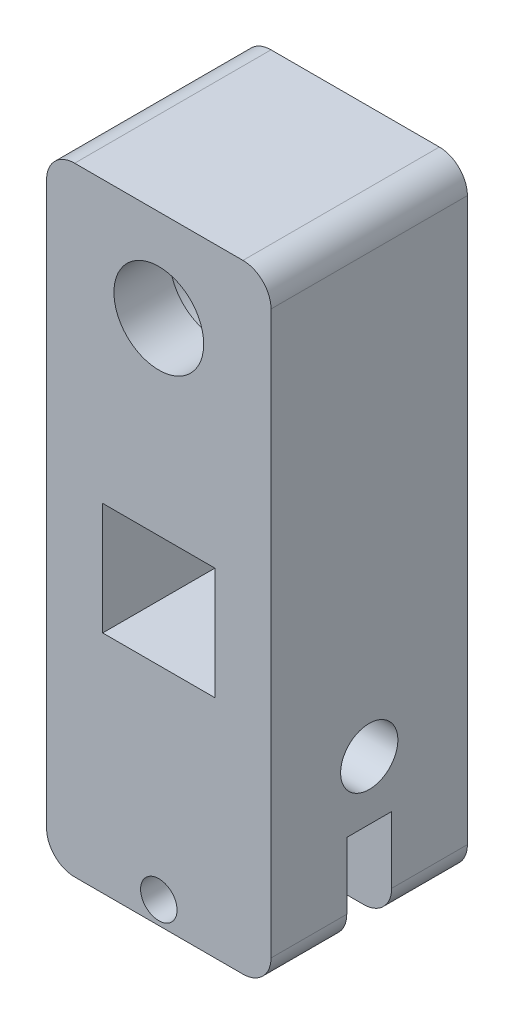
ISO-10303-21;
HEADER;
FILE_DESCRIPTION(('STEP AP214'),'2;1');
FILE_NAME('part.step','',(''),(''),'','','');
FILE_SCHEMA(('AUTOMOTIVE_DESIGN { 1 0 10303 214 1 1 1 1 }'));
ENDSEC;
DATA;
#1=APPLICATION_CONTEXT('core data for automotive mechanical design processes');
#2=APPLICATION_PROTOCOL_DEFINITION('international standard','automotive_design',2000,#1);
#3=PRODUCT_CONTEXT('',#1,'mechanical');
#4=PRODUCT('Part','Part','',(#3));
#5=PRODUCT_RELATED_PRODUCT_CATEGORY('part','',(#4));
#6=PRODUCT_DEFINITION_FORMATION('','',#4);
#7=PRODUCT_DEFINITION_CONTEXT('part definition',#1,'design');
#8=PRODUCT_DEFINITION('design','',#6,#7);
#9=PRODUCT_DEFINITION_SHAPE('','',#8);
#10=(LENGTH_UNIT() NAMED_UNIT(*) SI_UNIT(.MILLI.,.METRE.));
#11=(NAMED_UNIT(*) PLANE_ANGLE_UNIT() SI_UNIT($,.RADIAN.));
#12=(NAMED_UNIT(*) SI_UNIT($,.STERADIAN.) SOLID_ANGLE_UNIT());
#13=UNCERTAINTY_MEASURE_WITH_UNIT(LENGTH_MEASURE(1.E-05),#10,'distance_accuracy_value','');
#14=(GEOMETRIC_REPRESENTATION_CONTEXT(3) GLOBAL_UNCERTAINTY_ASSIGNED_CONTEXT((#13)) GLOBAL_UNIT_ASSIGNED_CONTEXT((#10,
#11,#12)) REPRESENTATION_CONTEXT('',''));
#15=CARTESIAN_POINT('',(0.,0.,0.));
#16=DIRECTION('',(0.,0.,1.));
#17=DIRECTION('',(1.,0.,0.));
#18=AXIS2_PLACEMENT_3D('',#15,#16,#17);
#19=CARTESIAN_POINT('',(40.,27.36,17.5));
#20=DIRECTION('',(-1.,0.,0.));
#21=DIRECTION('',(0.,0.,1.));
#22=AXIS2_PLACEMENT_3D('',#19,#20,#21);
#23=CYLINDRICAL_SURFACE('',#22,5.1);
#24=CARTESIAN_POINT('',(40.,27.36,17.5));
#25=DIRECTION('',(-1.,0.,0.));
#26=DIRECTION('',(0.,0.,1.));
#27=AXIS2_PLACEMENT_3D('',#24,#25,#26);
#28=CIRCLE('',#27,5.1);
#29=CARTESIAN_POINT('',(40.,27.36,22.6));
#30=VERTEX_POINT('',#29);
#31=EDGE_CURVE('E202',#30,#30,#28,.T.);
#32=ORIENTED_EDGE('',*,*,#31,.F.);
#33=EDGE_LOOP('',(#32));
#34=FACE_BOUND('',#33,.T.);
#35=CARTESIAN_POINT('',(3.5,27.36,17.5));
#36=DIRECTION('',(-1.,0.,0.));
#37=DIRECTION('',(0.,0.,1.));
#38=AXIS2_PLACEMENT_3D('',#35,#36,#37);
#39=CIRCLE('',#38,5.1);
#40=CARTESIAN_POINT('',(3.5,27.36,22.6));
#41=VERTEX_POINT('',#40);
#42=EDGE_CURVE('E409',#41,#41,#39,.F.);
#43=ORIENTED_EDGE('',*,*,#42,.F.);
#44=EDGE_LOOP('',(#43));
#45=FACE_BOUND('',#44,.T.);
#46=ADVANCED_FACE('F40',(#34,#45),#23,.F.);
#47=CARTESIAN_POINT('',(5.,5.,35.));
#48=DIRECTION('',(0.,0.,-1.));
#49=DIRECTION('',(-1.,0.,0.));
#50=AXIS2_PLACEMENT_3D('',#47,#48,#49);
#51=CYLINDRICAL_SURFACE('',#50,5.);
#52=CARTESIAN_POINT('',(5.,5.,21.5));
#53=DIRECTION('',(0.,0.,1.));
#54=DIRECTION('',(1.,0.,0.));
#55=AXIS2_PLACEMENT_3D('',#52,#53,#54);
#56=CIRCLE('',#55,5.);
#57=CARTESIAN_POINT('',(5.00000000000004,0.,21.5));
#58=VERTEX_POINT('',#57);
#59=CARTESIAN_POINT('',(0.,5.,21.5));
#60=VERTEX_POINT('',#59);
#61=EDGE_CURVE('E239',#58,#60,#56,.F.);
#62=ORIENTED_EDGE('',*,*,#61,.F.);
#63=DIRECTION('',(0.,0.,-1.));
#64=VECTOR('',#63,1.);
#65=CARTESIAN_POINT('',(5.00000000000004,0.,35.));
#66=LINE('',#65,#64);
#67=CARTESIAN_POINT('',(5.00000000000004,0.,35.));
#68=VERTEX_POINT('',#67);
#69=EDGE_CURVE('E380',#68,#58,#66,.T.);
#70=ORIENTED_EDGE('',*,*,#69,.F.);
#71=CARTESIAN_POINT('',(5.,5.,35.));
#72=DIRECTION('',(0.,0.,1.));
#73=DIRECTION('',(1.,0.,0.));
#74=AXIS2_PLACEMENT_3D('',#71,#72,#73);
#75=CIRCLE('',#74,5.);
#76=CARTESIAN_POINT('',(0.,5.00000000000004,35.));
#77=VERTEX_POINT('',#76);
#78=EDGE_CURVE('E278',#68,#77,#75,.F.);
#79=ORIENTED_EDGE('',*,*,#78,.T.);
#80=DIRECTION('',(0.,0.,-1.));
#81=VECTOR('',#80,1.);
#82=CARTESIAN_POINT('',(0.,5.00000000000004,35.));
#83=LINE('',#82,#81);
#84=EDGE_CURVE('E385',#77,#60,#83,.T.);
#85=ORIENTED_EDGE('',*,*,#84,.T.);
#86=EDGE_LOOP('',(#62,#70,#79,#85));
#87=FACE_BOUND('',#86,.T.);
#88=ADVANCED_FACE('F419',(#87),#51,.T.);
#89=CARTESIAN_POINT('',(0.,0.,35.));
#90=DIRECTION('',(0.,1.,0.));
#91=DIRECTION('',(0.,0.,1.));
#92=AXIS2_PLACEMENT_3D('',#89,#90,#91);
#93=PLANE('',#92);
#94=ORIENTED_EDGE('',*,*,#69,.T.);
#95=DIRECTION('',(-1.,0.,0.));
#96=VECTOR('',#95,1.);
#97=CARTESIAN_POINT('',(40.,0.,21.5));
#98=LINE('',#97,#96);
#99=CARTESIAN_POINT('',(35.,0.,21.5));
#100=VERTEX_POINT('',#99);
#101=EDGE_CURVE('E209',#100,#58,#98,.T.);
#102=ORIENTED_EDGE('',*,*,#101,.F.);
#103=DIRECTION('',(0.,0.,-1.));
#104=VECTOR('',#103,1.);
#105=CARTESIAN_POINT('',(35.,0.,35.));
#106=LINE('',#105,#104);
#107=CARTESIAN_POINT('',(35.,0.,35.));
#108=VERTEX_POINT('',#107);
#109=EDGE_CURVE('E375',#108,#100,#106,.T.);
#110=ORIENTED_EDGE('',*,*,#109,.F.);
#111=DIRECTION('',(1.,0.,0.));
#112=VECTOR('',#111,1.);
#113=CARTESIAN_POINT('',(0.,0.,35.));
#114=LINE('',#113,#112);
#115=EDGE_CURVE('E282',#68,#108,#114,.T.);
#116=ORIENTED_EDGE('',*,*,#115,.F.);
#117=EDGE_LOOP('',(#94,#102,#110,#116));
#118=FACE_BOUND('',#117,.T.);
#119=ADVANCED_FACE('F474',(#118),#93,.F.);
#120=CARTESIAN_POINT('',(35.,5.,35.));
#121=DIRECTION('',(0.,0.,-1.));
#122=DIRECTION('',(-1.,0.,0.));
#123=AXIS2_PLACEMENT_3D('',#120,#121,#122);
#124=CYLINDRICAL_SURFACE('',#123,5.);
#125=ORIENTED_EDGE('',*,*,#109,.T.);
#126=CARTESIAN_POINT('',(35.,5.,21.5));
#127=DIRECTION('',(0.,0.,1.));
#128=DIRECTION('',(1.,0.,0.));
#129=AXIS2_PLACEMENT_3D('',#126,#127,#128);
#130=CIRCLE('',#129,5.);
#131=CARTESIAN_POINT('',(40.,5.00000000000004,21.5));
#132=VERTEX_POINT('',#131);
#133=EDGE_CURVE('E235',#100,#132,#130,.T.);
#134=ORIENTED_EDGE('',*,*,#133,.T.);
#135=DIRECTION('',(0.,0.,-1.));
#136=VECTOR('',#135,1.);
#137=CARTESIAN_POINT('',(40.,5.00000000000004,35.));
#138=LINE('',#137,#136);
#139=CARTESIAN_POINT('',(40.,5.00000000000004,35.));
#140=VERTEX_POINT('',#139);
#141=EDGE_CURVE('E370',#140,#132,#138,.T.);
#142=ORIENTED_EDGE('',*,*,#141,.F.);
#143=CARTESIAN_POINT('',(35.,5.,35.));
#144=DIRECTION('',(0.,0.,1.));
#145=DIRECTION('',(1.,0.,0.));
#146=AXIS2_PLACEMENT_3D('',#143,#144,#145);
#147=CIRCLE('',#146,5.);
#148=EDGE_CURVE('E286',#108,#140,#147,.T.);
#149=ORIENTED_EDGE('',*,*,#148,.F.);
#150=EDGE_LOOP('',(#125,#134,#142,#149));
#151=FACE_BOUND('',#150,.T.);
#152=ADVANCED_FACE('F523',(#151),#124,.T.);
#153=CARTESIAN_POINT('',(20.,4.,35.));
#154=DIRECTION('',(0.,0.,-1.));
#155=DIRECTION('',(-1.,0.,0.));
#156=AXIS2_PLACEMENT_3D('',#153,#154,#155);
#157=CYLINDRICAL_SURFACE('',#156,3.25);
#158=CARTESIAN_POINT('',(20.,4.,21.5));
#159=DIRECTION('',(0.,0.,1.));
#160=DIRECTION('',(1.,0.,0.));
#161=AXIS2_PLACEMENT_3D('',#158,#159,#160);
#162=CIRCLE('',#161,3.25);
#163=CARTESIAN_POINT('',(23.25,4.,21.5));
#164=VERTEX_POINT('',#163);
#165=EDGE_CURVE('E234',#164,#164,#162,.T.);
#166=ORIENTED_EDGE('',*,*,#165,.F.);
#167=EDGE_LOOP('',(#166));
#168=FACE_BOUND('',#167,.T.);
#169=CARTESIAN_POINT('',(20.,4.,35.));
#170=DIRECTION('',(0.,0.,1.));
#171=DIRECTION('',(1.,0.,0.));
#172=AXIS2_PLACEMENT_3D('',#169,#170,#171);
#173=CIRCLE('',#172,3.25);
#174=CARTESIAN_POINT('',(23.25,4.,35.));
#175=VERTEX_POINT('',#174);
#176=EDGE_CURVE('E301',#175,#175,#173,.T.);
#177=ORIENTED_EDGE('',*,*,#176,.T.);
#178=EDGE_LOOP('',(#177));
#179=FACE_BOUND('',#178,.T.);
#180=ADVANCED_FACE('F501',(#168,#179),#157,.F.);
#181=CARTESIAN_POINT('',(20.,93.74,35.));
#182=DIRECTION('',(0.,0.,-1.));
#183=DIRECTION('',(-1.,0.,0.));
#184=AXIS2_PLACEMENT_3D('',#181,#182,#183);
#185=CYLINDRICAL_SURFACE('',#184,12.);
#186=CARTESIAN_POINT('',(20.,93.74,0.));
#187=DIRECTION('',(0.,0.,1.));
#188=DIRECTION('',(1.,0.,0.));
#189=AXIS2_PLACEMENT_3D('',#186,#187,#188);
#190=CIRCLE('',#189,12.);
#191=CARTESIAN_POINT('',(32.,93.74,0.));
#192=VERTEX_POINT('',#191);
#193=EDGE_CURVE('E352',#192,#192,#190,.T.);
#194=ORIENTED_EDGE('',*,*,#193,.F.);
#195=EDGE_LOOP('',(#194));
#196=FACE_BOUND('',#195,.T.);
#197=CARTESIAN_POINT('',(20.,93.74,25.));
#198=DIRECTION('',(0.,0.,1.));
#199=DIRECTION('',(1.,0.,0.));
#200=AXIS2_PLACEMENT_3D('',#197,#198,#199);
#201=CIRCLE('',#200,12.);
#202=CARTESIAN_POINT('',(32.,93.74,25.));
#203=VERTEX_POINT('',#202);
#204=EDGE_CURVE('E247',#203,#203,#201,.T.);
#205=ORIENTED_EDGE('',*,*,#204,.T.);
#206=EDGE_LOOP('',(#205));
#207=FACE_BOUND('',#206,.T.);
#208=ADVANCED_FACE('F502',(#196,#207),#185,.F.);
#209=CARTESIAN_POINT('',(5.,105.17,35.));
#210=DIRECTION('',(0.,0.,-1.));
#211=DIRECTION('',(-1.,0.,0.));
#212=AXIS2_PLACEMENT_3D('',#209,#210,#211);
#213=CYLINDRICAL_SURFACE('',#212,5.);
#214=CARTESIAN_POINT('',(5.,105.17,0.));
#215=DIRECTION('',(0.,0.,1.));
#216=DIRECTION('',(1.,0.,0.));
#217=AXIS2_PLACEMENT_3D('',#214,#215,#216);
#218=CIRCLE('',#217,5.);
#219=CARTESIAN_POINT('',(0.,105.17,0.));
#220=VERTEX_POINT('',#219);
#221=CARTESIAN_POINT('',(5.,110.17,0.));
#222=VERTEX_POINT('',#221);
#223=EDGE_CURVE('E320',#220,#222,#218,.F.);
#224=ORIENTED_EDGE('',*,*,#223,.F.);
#225=DIRECTION('',(0.,0.,-1.));
#226=VECTOR('',#225,1.);
#227=CARTESIAN_POINT('',(0.,105.17,35.));
#228=LINE('',#227,#226);
#229=CARTESIAN_POINT('',(0.,105.17,35.));
#230=VERTEX_POINT('',#229);
#231=EDGE_CURVE('E389',#230,#220,#228,.T.);
#232=ORIENTED_EDGE('',*,*,#231,.F.);
#233=CARTESIAN_POINT('',(5.,105.17,35.));
#234=DIRECTION('',(0.,0.,1.));
#235=DIRECTION('',(1.,0.,0.));
#236=AXIS2_PLACEMENT_3D('',#233,#234,#235);
#237=CIRCLE('',#236,5.);
#238=CARTESIAN_POINT('',(5.,110.17,35.));
#239=VERTEX_POINT('',#238);
#240=EDGE_CURVE('E270',#230,#239,#237,.F.);
#241=ORIENTED_EDGE('',*,*,#240,.T.);
#242=DIRECTION('',(0.,0.,-1.));
#243=VECTOR('',#242,1.);
#244=CARTESIAN_POINT('',(5.,110.17,35.));
#245=LINE('',#244,#243);
#246=EDGE_CURVE('E359',#239,#222,#245,.T.);
#247=ORIENTED_EDGE('',*,*,#246,.T.);
#248=EDGE_LOOP('',(#224,#232,#241,#247));
#249=FACE_BOUND('',#248,.T.);
#250=ADVANCED_FACE('F431',(#249),#213,.T.);
#251=CARTESIAN_POINT('',(0.,0.,35.));
#252=DIRECTION('',(-1.,0.,0.));
#253=DIRECTION('',(0.,0.,1.));
#254=AXIS2_PLACEMENT_3D('',#251,#252,#253);
#255=PLANE('',#254);
#256=CARTESIAN_POINT('',(0.,27.36,17.5));
#257=DIRECTION('',(-1.,0.,0.));
#258=DIRECTION('',(0.,0.,1.));
#259=AXIS2_PLACEMENT_3D('',#256,#257,#258);
#260=CIRCLE('',#259,11.);
#261=CARTESIAN_POINT('',(0.,16.86,20.778719262151));
#262=VERTEX_POINT('',#261);
#263=CARTESIAN_POINT('',(0.,16.86,14.221280737849));
#264=VERTEX_POINT('',#263);
#265=EDGE_CURVE('E178',#262,#264,#260,.T.);
#266=ORIENTED_EDGE('',*,*,#265,.F.);
#267=DIRECTION('',(0.,0.,-1.));
#268=VECTOR('',#267,1.);
#269=CARTESIAN_POINT('',(0.,16.86,13.5));
#270=LINE('',#269,#268);
#271=CARTESIAN_POINT('',(0.,16.86,21.5));
#272=VERTEX_POINT('',#271);
#273=EDGE_CURVE('E197',#272,#262,#270,.T.);
#274=ORIENTED_EDGE('',*,*,#273,.F.);
#275=DIRECTION('',(0.,1.,0.));
#276=VECTOR('',#275,1.);
#277=CARTESIAN_POINT('',(0.,0.,21.5));
#278=LINE('',#277,#276);
#279=EDGE_CURVE('E198',#60,#272,#278,.T.);
#280=ORIENTED_EDGE('',*,*,#279,.F.);
#281=ORIENTED_EDGE('',*,*,#84,.F.);
#282=DIRECTION('',(0.,1.,0.));
#283=VECTOR('',#282,1.);
#284=CARTESIAN_POINT('',(0.,0.,35.));
#285=LINE('',#284,#283);
#286=EDGE_CURVE('E274',#77,#230,#285,.T.);
#287=ORIENTED_EDGE('',*,*,#286,.T.);
#288=ORIENTED_EDGE('',*,*,#231,.T.);
#289=DIRECTION('',(0.,1.,0.));
#290=VECTOR('',#289,1.);
#291=CARTESIAN_POINT('',(0.,0.,0.));
#292=LINE('',#291,#290);
#293=CARTESIAN_POINT('',(0.,5.00000000000004,0.));
#294=VERTEX_POINT('',#293);
#295=EDGE_CURVE('E324',#294,#220,#292,.T.);
#296=ORIENTED_EDGE('',*,*,#295,.F.);
#297=CARTESIAN_POINT('',(0.,5.,13.5));
#298=VERTEX_POINT('',#297);
#299=EDGE_CURVE('E384',#298,#294,#83,.T.);
#300=ORIENTED_EDGE('',*,*,#299,.F.);
#301=DIRECTION('',(0.,-1.,0.));
#302=VECTOR('',#301,1.);
#303=CARTESIAN_POINT('',(0.,0.,13.5));
#304=LINE('',#303,#302);
#305=CARTESIAN_POINT('',(0.,16.86,13.5));
#306=VERTEX_POINT('',#305);
#307=EDGE_CURVE('E195',#306,#298,#304,.T.);
#308=ORIENTED_EDGE('',*,*,#307,.F.);
#309=EDGE_CURVE('E190',#264,#306,#270,.T.);
#310=ORIENTED_EDGE('',*,*,#309,.F.);
#311=EDGE_LOOP('',(#266,#274,#280,#281,#287,#288,#296,#300,#308,#310));
#312=FACE_BOUND('',#311,.T.);
#313=ADVANCED_FACE('F193',(#312),#255,.T.);
#314=CARTESIAN_POINT('',(5.,5.,13.5));
#315=DIRECTION('',(0.,0.,-1.));
#316=DIRECTION('',(0.,1.,0.));
#317=AXIS2_PLACEMENT_3D('',#314,#315,#316);
#318=CIRCLE('',#317,5.);
#319=CARTESIAN_POINT('',(5.00000000000004,0.,13.5));
#320=VERTEX_POINT('',#319);
#321=EDGE_CURVE('E231',#298,#320,#318,.F.);
#322=ORIENTED_EDGE('',*,*,#321,.F.);
#323=ORIENTED_EDGE('',*,*,#299,.T.);
#324=CARTESIAN_POINT('',(5.,5.,0.));
#325=DIRECTION('',(0.,0.,1.));
#326=DIRECTION('',(1.,0.,0.));
#327=AXIS2_PLACEMENT_3D('',#324,#325,#326);
#328=CIRCLE('',#327,5.);
#329=CARTESIAN_POINT('',(5.00000000000004,0.,0.));
#330=VERTEX_POINT('',#329);
#331=EDGE_CURVE('E328',#330,#294,#328,.F.);
#332=ORIENTED_EDGE('',*,*,#331,.F.);
#333=EDGE_CURVE('E379',#320,#330,#66,.T.);
#334=ORIENTED_EDGE('',*,*,#333,.F.);
#335=EDGE_LOOP('',(#322,#323,#332,#334));
#336=FACE_BOUND('',#335,.T.);
#337=ADVANCED_FACE('F442',(#336),#51,.T.);
#338=CARTESIAN_POINT('',(35.,0.,13.5));
#339=VERTEX_POINT('',#338);
#340=CARTESIAN_POINT('',(35.,0.,0.));
#341=VERTEX_POINT('',#340);
#342=EDGE_CURVE('E374',#339,#341,#106,.T.);
#343=ORIENTED_EDGE('',*,*,#342,.F.);
#344=DIRECTION('',(-1.,0.,0.));
#345=VECTOR('',#344,1.);
#346=CARTESIAN_POINT('',(40.,0.,13.5));
#347=LINE('',#346,#345);
#348=EDGE_CURVE('E213',#339,#320,#347,.T.);
#349=ORIENTED_EDGE('',*,*,#348,.T.);
#350=ORIENTED_EDGE('',*,*,#333,.T.);
#351=DIRECTION('',(1.,0.,0.));
#352=VECTOR('',#351,1.);
#353=CARTESIAN_POINT('',(0.,0.,0.));
#354=LINE('',#353,#352);
#355=EDGE_CURVE('E332',#330,#341,#354,.T.);
#356=ORIENTED_EDGE('',*,*,#355,.T.);
#357=EDGE_LOOP('',(#343,#349,#350,#356));
#358=FACE_BOUND('',#357,.T.);
#359=ADVANCED_FACE('F521',(#358),#93,.F.);
#360=CARTESIAN_POINT('',(40.,5.00000000000004,13.5));
#361=VERTEX_POINT('',#360);
#362=CARTESIAN_POINT('',(40.,5.00000000000004,0.));
#363=VERTEX_POINT('',#362);
#364=EDGE_CURVE('E369',#361,#363,#138,.T.);
#365=ORIENTED_EDGE('',*,*,#364,.F.);
#366=CARTESIAN_POINT('',(35.,5.,13.5));
#367=DIRECTION('',(0.,0.,-1.));
#368=DIRECTION('',(0.,1.,0.));
#369=AXIS2_PLACEMENT_3D('',#366,#367,#368);
#370=CIRCLE('',#369,5.);
#371=EDGE_CURVE('E227',#361,#339,#370,.T.);
#372=ORIENTED_EDGE('',*,*,#371,.T.);
#373=ORIENTED_EDGE('',*,*,#342,.T.);
#374=CARTESIAN_POINT('',(35.,5.,0.));
#375=DIRECTION('',(0.,0.,1.));
#376=DIRECTION('',(1.,0.,0.));
#377=AXIS2_PLACEMENT_3D('',#374,#375,#376);
#378=CIRCLE('',#377,5.);
#379=EDGE_CURVE('E336',#341,#363,#378,.T.);
#380=ORIENTED_EDGE('',*,*,#379,.T.);
#381=EDGE_LOOP('',(#365,#372,#373,#380));
#382=FACE_BOUND('',#381,.T.);
#383=ADVANCED_FACE('F518',(#382),#124,.T.);
#384=CARTESIAN_POINT('',(40.,0.,35.));
#385=DIRECTION('',(-1.,0.,0.));
#386=DIRECTION('',(0.,0.,1.));
#387=AXIS2_PLACEMENT_3D('',#384,#385,#386);
#388=PLANE('',#387);
#389=ORIENTED_EDGE('',*,*,#141,.T.);
#390=DIRECTION('',(0.,1.,0.));
#391=VECTOR('',#390,1.);
#392=CARTESIAN_POINT('',(40.,0.,21.5));
#393=LINE('',#392,#391);
#394=CARTESIAN_POINT('',(40.,16.86,21.5));
#395=VERTEX_POINT('',#394);
#396=EDGE_CURVE('E208',#132,#395,#393,.T.);
#397=ORIENTED_EDGE('',*,*,#396,.T.);
#398=DIRECTION('',(0.,0.,-1.));
#399=VECTOR('',#398,1.);
#400=CARTESIAN_POINT('',(40.,16.86,13.5));
#401=LINE('',#400,#399);
#402=CARTESIAN_POINT('',(40.,16.86,13.5));
#403=VERTEX_POINT('',#402);
#404=EDGE_CURVE('E449',#395,#403,#401,.T.);
#405=ORIENTED_EDGE('',*,*,#404,.T.);
#406=DIRECTION('',(0.,-1.,0.));
#407=VECTOR('',#406,1.);
#408=CARTESIAN_POINT('',(40.,0.,13.5));
#409=LINE('',#408,#407);
#410=EDGE_CURVE('E63',#403,#361,#409,.T.);
#411=ORIENTED_EDGE('',*,*,#410,.T.);
#412=ORIENTED_EDGE('',*,*,#364,.T.);
#413=DIRECTION('',(0.,1.,0.));
#414=VECTOR('',#413,1.);
#415=CARTESIAN_POINT('',(40.,0.,0.));
#416=LINE('',#415,#414);
#417=CARTESIAN_POINT('',(40.,105.17,0.));
#418=VERTEX_POINT('',#417);
#419=EDGE_CURVE('E340',#363,#418,#416,.T.);
#420=ORIENTED_EDGE('',*,*,#419,.T.);
#421=DIRECTION('',(0.,0.,-1.));
#422=VECTOR('',#421,1.);
#423=CARTESIAN_POINT('',(40.,105.17,35.));
#424=LINE('',#423,#422);
#425=CARTESIAN_POINT('',(40.,105.17,35.));
#426=VERTEX_POINT('',#425);
#427=EDGE_CURVE('E366',#426,#418,#424,.T.);
#428=ORIENTED_EDGE('',*,*,#427,.F.);
#429=DIRECTION('',(0.,1.,0.));
#430=VECTOR('',#429,1.);
#431=CARTESIAN_POINT('',(40.,0.,35.));
#432=LINE('',#431,#430);
#433=EDGE_CURVE('E290',#140,#426,#432,.T.);
#434=ORIENTED_EDGE('',*,*,#433,.F.);
#435=EDGE_LOOP('',(#389,#397,#405,#411,#412,#420,#428,#434));
#436=FACE_BOUND('',#435,.T.);
#437=ORIENTED_EDGE('',*,*,#31,.T.);
#438=EDGE_LOOP('',(#437));
#439=FACE_BOUND('',#438,.T.);
#440=ADVANCED_FACE('F514',(#436,#439),#388,.F.);
#441=CARTESIAN_POINT('',(35.,105.17,35.));
#442=DIRECTION('',(0.,0.,-1.));
#443=DIRECTION('',(-1.,0.,0.));
#444=AXIS2_PLACEMENT_3D('',#441,#442,#443);
#445=CYLINDRICAL_SURFACE('',#444,5.);
#446=CARTESIAN_POINT('',(35.,105.17,0.));
#447=DIRECTION('',(0.,0.,1.));
#448=DIRECTION('',(1.,0.,0.));
#449=AXIS2_PLACEMENT_3D('',#446,#447,#448);
#450=CIRCLE('',#449,5.);
#451=CARTESIAN_POINT('',(35.,110.17,0.));
#452=VERTEX_POINT('',#451);
#453=EDGE_CURVE('E344',#452,#418,#450,.F.);
#454=ORIENTED_EDGE('',*,*,#453,.F.);
#455=DIRECTION('',(0.,0.,-1.));
#456=VECTOR('',#455,1.);
#457=CARTESIAN_POINT('',(35.,110.17,35.));
#458=LINE('',#457,#456);
#459=CARTESIAN_POINT('',(35.,110.17,35.));
#460=VERTEX_POINT('',#459);
#461=EDGE_CURVE('E362',#460,#452,#458,.T.);
#462=ORIENTED_EDGE('',*,*,#461,.F.);
#463=CARTESIAN_POINT('',(35.,105.17,35.));
#464=DIRECTION('',(0.,0.,1.));
#465=DIRECTION('',(1.,0.,0.));
#466=AXIS2_PLACEMENT_3D('',#463,#464,#465);
#467=CIRCLE('',#466,5.);
#468=EDGE_CURVE('E293',#460,#426,#467,.F.);
#469=ORIENTED_EDGE('',*,*,#468,.T.);
#470=ORIENTED_EDGE('',*,*,#427,.T.);
#471=EDGE_LOOP('',(#454,#462,#469,#470));
#472=FACE_BOUND('',#471,.T.);
#473=ADVANCED_FACE('F511',(#472),#445,.T.);
#474=CARTESIAN_POINT('',(0.,40.17,35.));
#475=DIRECTION('',(0.,1.,0.));
#476=DIRECTION('',(0.,0.,1.));
#477=AXIS2_PLACEMENT_3D('',#474,#475,#476);
#478=PLANE('',#477);
#479=DIRECTION('',(1.,0.,0.));
#480=VECTOR('',#479,1.);
#481=CARTESIAN_POINT('',(0.,40.17,0.));
#482=LINE('',#481,#480);
#483=CARTESIAN_POINT('',(10.,40.17,0.));
#484=VERTEX_POINT('',#483);
#485=CARTESIAN_POINT('',(30.,40.17,0.));
#486=VERTEX_POINT('',#485);
#487=EDGE_CURVE('E254',#484,#486,#482,.T.);
#488=ORIENTED_EDGE('',*,*,#487,.F.);
#489=DIRECTION('',(0.,0.,-1.));
#490=VECTOR('',#489,1.);
#491=CARTESIAN_POINT('',(10.,40.17,35.));
#492=LINE('',#491,#490);
#493=CARTESIAN_POINT('',(10.,40.17,35.));
#494=VERTEX_POINT('',#493);
#495=EDGE_CURVE('E363',#494,#484,#492,.T.);
#496=ORIENTED_EDGE('',*,*,#495,.F.);
#497=DIRECTION('',(1.,0.,0.));
#498=VECTOR('',#497,1.);
#499=CARTESIAN_POINT('',(0.,40.17,35.));
#500=LINE('',#499,#498);
#501=CARTESIAN_POINT('',(30.,40.17,35.));
#502=VERTEX_POINT('',#501);
#503=EDGE_CURVE('E255',#494,#502,#500,.T.);
#504=ORIENTED_EDGE('',*,*,#503,.T.);
#505=DIRECTION('',(0.,0.,-1.));
#506=VECTOR('',#505,1.);
#507=CARTESIAN_POINT('',(30.,40.17,35.));
#508=LINE('',#507,#506);
#509=EDGE_CURVE('E305',#502,#486,#508,.T.);
#510=ORIENTED_EDGE('',*,*,#509,.T.);
#511=EDGE_LOOP('',(#488,#496,#504,#510));
#512=FACE_BOUND('',#511,.T.);
#513=ADVANCED_FACE('F42',(#512),#478,.T.);
#514=CARTESIAN_POINT('',(10.,0.,35.));
#515=DIRECTION('',(1.,0.,0.));
#516=DIRECTION('',(0.,1.,0.));
#517=AXIS2_PLACEMENT_3D('',#514,#515,#516);
#518=PLANE('',#517);
#519=DIRECTION('',(0.,-1.,0.));
#520=VECTOR('',#519,1.);
#521=CARTESIAN_POINT('',(10.,0.,0.));
#522=LINE('',#521,#520);
#523=CARTESIAN_POINT('',(10.,60.17,0.));
#524=VERTEX_POINT('',#523);
#525=EDGE_CURVE('E309',#524,#484,#522,.T.);
#526=ORIENTED_EDGE('',*,*,#525,.F.);
#527=DIRECTION('',(0.,0.,-1.));
#528=VECTOR('',#527,1.);
#529=CARTESIAN_POINT('',(10.,60.17,35.));
#530=LINE('',#529,#528);
#531=CARTESIAN_POINT('',(10.,60.17,35.));
#532=VERTEX_POINT('',#531);
#533=EDGE_CURVE('E398',#532,#524,#530,.T.);
#534=ORIENTED_EDGE('',*,*,#533,.F.);
#535=DIRECTION('',(0.,-1.,0.));
#536=VECTOR('',#535,1.);
#537=CARTESIAN_POINT('',(10.,0.,35.));
#538=LINE('',#537,#536);
#539=EDGE_CURVE('E259',#532,#494,#538,.T.);
#540=ORIENTED_EDGE('',*,*,#539,.T.);
#541=ORIENTED_EDGE('',*,*,#495,.T.);
#542=EDGE_LOOP('',(#526,#534,#540,#541));
#543=FACE_BOUND('',#542,.T.);
#544=ADVANCED_FACE('F536',(#543),#518,.T.);
#545=CARTESIAN_POINT('',(0.,60.17,35.));
#546=DIRECTION('',(0.,1.,0.));
#547=DIRECTION('',(0.,0.,1.));
#548=AXIS2_PLACEMENT_3D('',#545,#546,#547);
#549=PLANE('',#548);
#550=DIRECTION('',(1.,0.,0.));
#551=VECTOR('',#550,1.);
#552=CARTESIAN_POINT('',(0.,60.17,0.));
#553=LINE('',#552,#551);
#554=CARTESIAN_POINT('',(30.,60.17,0.));
#555=VERTEX_POINT('',#554);
#556=EDGE_CURVE('E313',#524,#555,#553,.T.);
#557=ORIENTED_EDGE('',*,*,#556,.T.);
#558=DIRECTION('',(0.,0.,-1.));
#559=VECTOR('',#558,1.);
#560=CARTESIAN_POINT('',(30.,60.17,35.));
#561=LINE('',#560,#559);
#562=CARTESIAN_POINT('',(30.,60.17,35.));
#563=VERTEX_POINT('',#562);
#564=EDGE_CURVE('E394',#563,#555,#561,.T.);
#565=ORIENTED_EDGE('',*,*,#564,.F.);
#566=DIRECTION('',(1.,0.,0.));
#567=VECTOR('',#566,1.);
#568=CARTESIAN_POINT('',(0.,60.17,35.));
#569=LINE('',#568,#567);
#570=EDGE_CURVE('E264',#532,#563,#569,.T.);
#571=ORIENTED_EDGE('',*,*,#570,.F.);
#572=ORIENTED_EDGE('',*,*,#533,.T.);
#573=EDGE_LOOP('',(#557,#565,#571,#572));
#574=FACE_BOUND('',#573,.T.);
#575=ADVANCED_FACE('F509',(#574),#549,.F.);
#576=CARTESIAN_POINT('',(0.,110.17,35.));
#577=DIRECTION('',(0.,1.,0.));
#578=DIRECTION('',(0.,0.,1.));
#579=AXIS2_PLACEMENT_3D('',#576,#577,#578);
#580=PLANE('',#579);
#581=DIRECTION('',(1.,0.,0.));
#582=VECTOR('',#581,1.);
#583=CARTESIAN_POINT('',(0.,110.17,0.));
#584=LINE('',#583,#582);
#585=EDGE_CURVE('E348',#222,#452,#584,.T.);
#586=ORIENTED_EDGE('',*,*,#585,.F.);
#587=ORIENTED_EDGE('',*,*,#246,.F.);
#588=DIRECTION('',(1.,0.,0.));
#589=VECTOR('',#588,1.);
#590=CARTESIAN_POINT('',(0.,110.17,35.));
#591=LINE('',#590,#589);
#592=EDGE_CURVE('E297',#239,#460,#591,.T.);
#593=ORIENTED_EDGE('',*,*,#592,.T.);
#594=ORIENTED_EDGE('',*,*,#461,.T.);
#595=EDGE_LOOP('',(#586,#587,#593,#594));
#596=FACE_BOUND('',#595,.T.);
#597=ADVANCED_FACE('F506',(#596),#580,.T.);
#598=CARTESIAN_POINT('',(30.,0.,35.));
#599=DIRECTION('',(1.,0.,0.));
#600=DIRECTION('',(0.,1.,0.));
#601=AXIS2_PLACEMENT_3D('',#598,#599,#600);
#602=PLANE('',#601);
#603=DIRECTION('',(0.,-1.,0.));
#604=VECTOR('',#603,1.);
#605=CARTESIAN_POINT('',(30.,0.,0.));
#606=LINE('',#605,#604);
#607=EDGE_CURVE('E316',#555,#486,#606,.T.);
#608=ORIENTED_EDGE('',*,*,#607,.T.);
#609=ORIENTED_EDGE('',*,*,#509,.F.);
#610=DIRECTION('',(0.,-1.,0.));
#611=VECTOR('',#610,1.);
#612=CARTESIAN_POINT('',(30.,0.,35.));
#613=LINE('',#612,#611);
#614=EDGE_CURVE('E267',#563,#502,#613,.T.);
#615=ORIENTED_EDGE('',*,*,#614,.F.);
#616=ORIENTED_EDGE('',*,*,#564,.T.);
#617=EDGE_LOOP('',(#608,#609,#615,#616));
#618=FACE_BOUND('',#617,.T.);
#619=ADVANCED_FACE('F499',(#618),#602,.F.);
#620=CARTESIAN_POINT('',(20.,4.,13.5));
#621=DIRECTION('',(0.,0.,-1.));
#622=DIRECTION('',(0.,1.,0.));
#623=AXIS2_PLACEMENT_3D('',#620,#621,#622);
#624=CIRCLE('',#623,3.25);
#625=CARTESIAN_POINT('',(20.,7.25,13.5));
#626=VERTEX_POINT('',#625);
#627=EDGE_CURVE('E212',#626,#626,#624,.T.);
#628=ORIENTED_EDGE('',*,*,#627,.F.);
#629=EDGE_LOOP('',(#628));
#630=FACE_BOUND('',#629,.T.);
#631=CARTESIAN_POINT('',(20.,4.,0.));
#632=DIRECTION('',(0.,0.,1.));
#633=DIRECTION('',(1.,0.,0.));
#634=AXIS2_PLACEMENT_3D('',#631,#632,#633);
#635=CIRCLE('',#634,3.25);
#636=CARTESIAN_POINT('',(23.25,4.,0.));
#637=VERTEX_POINT('',#636);
#638=EDGE_CURVE('E260',#637,#637,#635,.T.);
#639=ORIENTED_EDGE('',*,*,#638,.F.);
#640=EDGE_LOOP('',(#639));
#641=FACE_BOUND('',#640,.T.);
#642=ADVANCED_FACE('F492',(#630,#641),#157,.F.);
#643=CARTESIAN_POINT('',(0.,0.,35.));
#644=DIRECTION('',(0.,0.,1.));
#645=DIRECTION('',(1.,0.,0.));
#646=AXIS2_PLACEMENT_3D('',#643,#644,#645);
#647=PLANE('',#646);
#648=ORIENTED_EDGE('',*,*,#503,.F.);
#649=ORIENTED_EDGE('',*,*,#539,.F.);
#650=ORIENTED_EDGE('',*,*,#570,.T.);
#651=ORIENTED_EDGE('',*,*,#614,.T.);
#652=EDGE_LOOP('',(#648,#649,#650,#651));
#653=FACE_BOUND('',#652,.T.);
#654=ORIENTED_EDGE('',*,*,#240,.F.);
#655=ORIENTED_EDGE('',*,*,#286,.F.);
#656=ORIENTED_EDGE('',*,*,#78,.F.);
#657=ORIENTED_EDGE('',*,*,#115,.T.);
#658=ORIENTED_EDGE('',*,*,#148,.T.);
#659=ORIENTED_EDGE('',*,*,#433,.T.);
#660=ORIENTED_EDGE('',*,*,#468,.F.);
#661=ORIENTED_EDGE('',*,*,#592,.F.);
#662=EDGE_LOOP('',(#654,#655,#656,#657,#658,#659,#660,#661));
#663=FACE_BOUND('',#662,.T.);
#664=ORIENTED_EDGE('',*,*,#176,.F.);
#665=EDGE_LOOP('',(#664));
#666=FACE_BOUND('',#665,.T.);
#667=CARTESIAN_POINT('',(20.,93.74,35.));
#668=DIRECTION('',(0.,0.,1.));
#669=DIRECTION('',(1.,0.,0.));
#670=AXIS2_PLACEMENT_3D('',#667,#668,#669);
#671=CIRCLE('',#670,8.);
#672=CARTESIAN_POINT('',(28.,93.74,35.));
#673=VERTEX_POINT('',#672);
#674=EDGE_CURVE('E242',#673,#673,#671,.T.);
#675=ORIENTED_EDGE('',*,*,#674,.F.);
#676=EDGE_LOOP('',(#675));
#677=FACE_BOUND('',#676,.T.);
#678=ADVANCED_FACE('F424',(#653,#663,#666,#677),#647,.T.);
#679=CARTESIAN_POINT('',(0.,0.,0.));
#680=DIRECTION('',(0.,0.,1.));
#681=DIRECTION('',(1.,0.,0.));
#682=AXIS2_PLACEMENT_3D('',#679,#680,#681);
#683=PLANE('',#682);
#684=ORIENTED_EDGE('',*,*,#487,.T.);
#685=ORIENTED_EDGE('',*,*,#607,.F.);
#686=ORIENTED_EDGE('',*,*,#556,.F.);
#687=ORIENTED_EDGE('',*,*,#525,.T.);
#688=EDGE_LOOP('',(#684,#685,#686,#687));
#689=FACE_BOUND('',#688,.T.);
#690=ORIENTED_EDGE('',*,*,#223,.T.);
#691=ORIENTED_EDGE('',*,*,#585,.T.);
#692=ORIENTED_EDGE('',*,*,#453,.T.);
#693=ORIENTED_EDGE('',*,*,#419,.F.);
#694=ORIENTED_EDGE('',*,*,#379,.F.);
#695=ORIENTED_EDGE('',*,*,#355,.F.);
#696=ORIENTED_EDGE('',*,*,#331,.T.);
#697=ORIENTED_EDGE('',*,*,#295,.T.);
#698=EDGE_LOOP('',(#690,#691,#692,#693,#694,#695,#696,#697));
#699=FACE_BOUND('',#698,.T.);
#700=ORIENTED_EDGE('',*,*,#193,.T.);
#701=EDGE_LOOP('',(#700));
#702=FACE_BOUND('',#701,.T.);
#703=ORIENTED_EDGE('',*,*,#638,.T.);
#704=EDGE_LOOP('',(#703));
#705=FACE_BOUND('',#704,.T.);
#706=ADVANCED_FACE('F434',(#689,#699,#702,#705),#683,.F.);
#707=CARTESIAN_POINT('',(20.,93.74,25.));
#708=DIRECTION('',(0.,0.,1.));
#709=DIRECTION('',(1.,0.,0.));
#710=AXIS2_PLACEMENT_3D('',#707,#708,#709);
#711=PLANE('',#710);
#712=CARTESIAN_POINT('',(20.,93.74,25.));
#713=DIRECTION('',(0.,0.,1.));
#714=DIRECTION('',(1.,0.,0.));
#715=AXIS2_PLACEMENT_3D('',#712,#713,#714);
#716=CIRCLE('',#715,8.);
#717=CARTESIAN_POINT('',(28.,93.74,25.));
#718=VERTEX_POINT('',#717);
#719=EDGE_CURVE('E243',#718,#718,#716,.T.);
#720=ORIENTED_EDGE('',*,*,#719,.T.);
#721=EDGE_LOOP('',(#720));
#722=FACE_BOUND('',#721,.T.);
#723=ORIENTED_EDGE('',*,*,#204,.F.);
#724=EDGE_LOOP('',(#723));
#725=FACE_BOUND('',#724,.T.);
#726=ADVANCED_FACE('F485',(#722,#725),#711,.F.);
#727=CARTESIAN_POINT('',(20.,93.74,25.));
#728=DIRECTION('',(0.,0.,1.));
#729=DIRECTION('',(1.,0.,0.));
#730=AXIS2_PLACEMENT_3D('',#727,#728,#729);
#731=CYLINDRICAL_SURFACE('',#730,8.);
#732=ORIENTED_EDGE('',*,*,#719,.F.);
#733=EDGE_LOOP('',(#732));
#734=FACE_BOUND('',#733,.T.);
#735=ORIENTED_EDGE('',*,*,#674,.T.);
#736=EDGE_LOOP('',(#735));
#737=FACE_BOUND('',#736,.T.);
#738=ADVANCED_FACE('F482',(#734,#737),#731,.F.);
#739=CARTESIAN_POINT('',(40.,0.,21.5));
#740=DIRECTION('',(0.,0.,1.));
#741=DIRECTION('',(1.,0.,0.));
#742=AXIS2_PLACEMENT_3D('',#739,#740,#741);
#743=PLANE('',#742);
#744=ORIENTED_EDGE('',*,*,#61,.T.);
#745=ORIENTED_EDGE('',*,*,#279,.T.);
#746=DIRECTION('',(-1.,0.,0.));
#747=VECTOR('',#746,1.);
#748=CARTESIAN_POINT('',(40.,16.86,21.5));
#749=LINE('',#748,#747);
#750=EDGE_CURVE('E220',#395,#272,#749,.T.);
#751=ORIENTED_EDGE('',*,*,#750,.F.);
#752=ORIENTED_EDGE('',*,*,#396,.F.);
#753=ORIENTED_EDGE('',*,*,#133,.F.);
#754=ORIENTED_EDGE('',*,*,#101,.T.);
#755=EDGE_LOOP('',(#744,#745,#751,#752,#753,#754));
#756=FACE_BOUND('',#755,.T.);
#757=ORIENTED_EDGE('',*,*,#165,.T.);
#758=EDGE_LOOP('',(#757));
#759=FACE_BOUND('',#758,.T.);
#760=ADVANCED_FACE('F480',(#756,#759),#743,.F.);
#761=CARTESIAN_POINT('',(40.,0.,13.5));
#762=DIRECTION('',(0.,0.,-1.));
#763=DIRECTION('',(0.,1.,0.));
#764=AXIS2_PLACEMENT_3D('',#761,#762,#763);
#765=PLANE('',#764);
#766=ORIENTED_EDGE('',*,*,#321,.T.);
#767=ORIENTED_EDGE('',*,*,#348,.F.);
#768=ORIENTED_EDGE('',*,*,#371,.F.);
#769=ORIENTED_EDGE('',*,*,#410,.F.);
#770=DIRECTION('',(-1.,0.,0.));
#771=VECTOR('',#770,1.);
#772=CARTESIAN_POINT('',(40.,16.86,13.5));
#773=LINE('',#772,#771);
#774=EDGE_CURVE('E217',#403,#306,#773,.T.);
#775=ORIENTED_EDGE('',*,*,#774,.T.);
#776=ORIENTED_EDGE('',*,*,#307,.T.);
#777=EDGE_LOOP('',(#766,#767,#768,#769,#775,#776));
#778=FACE_BOUND('',#777,.T.);
#779=ORIENTED_EDGE('',*,*,#627,.T.);
#780=EDGE_LOOP('',(#779));
#781=FACE_BOUND('',#780,.T.);
#782=ADVANCED_FACE('F709',(#778,#781),#765,.F.);
#783=CARTESIAN_POINT('',(40.,16.86,13.5));
#784=DIRECTION('',(0.,1.,0.));
#785=DIRECTION('',(0.,0.,1.));
#786=AXIS2_PLACEMENT_3D('',#783,#784,#785);
#787=PLANE('',#786);
#788=DIRECTION('',(0.,0.,1.));
#789=VECTOR('',#788,1.);
#790=CARTESIAN_POINT('',(3.5,16.86,13.5));
#791=LINE('',#790,#789);
#792=CARTESIAN_POINT('',(3.5,16.86,14.221280737849));
#793=VERTEX_POINT('',#792);
#794=CARTESIAN_POINT('',(3.5,16.86,20.778719262151));
#795=VERTEX_POINT('',#794);
#796=EDGE_CURVE('E191',#793,#795,#791,.T.);
#797=ORIENTED_EDGE('',*,*,#796,.F.);
#798=DIRECTION('',(-1.,0.,0.));
#799=VECTOR('',#798,1.);
#800=CARTESIAN_POINT('',(3.5,16.86,14.221280737849));
#801=LINE('',#800,#799);
#802=EDGE_CURVE('E11',#793,#264,#801,.T.);
#803=ORIENTED_EDGE('',*,*,#802,.T.);
#804=ORIENTED_EDGE('',*,*,#309,.T.);
#805=ORIENTED_EDGE('',*,*,#774,.F.);
#806=ORIENTED_EDGE('',*,*,#404,.F.);
#807=ORIENTED_EDGE('',*,*,#750,.T.);
#808=ORIENTED_EDGE('',*,*,#273,.T.);
#809=DIRECTION('',(-1.,0.,0.));
#810=VECTOR('',#809,1.);
#811=CARTESIAN_POINT('',(3.5,16.86,20.778719262151));
#812=LINE('',#811,#810);
#813=EDGE_CURVE('E49',#262,#795,#812,.F.);
#814=ORIENTED_EDGE('',*,*,#813,.T.);
#815=EDGE_LOOP('',(#797,#803,#804,#805,#806,#807,#808,#814));
#816=FACE_BOUND('',#815,.T.);
#817=ADVANCED_FACE('F189',(#816),#787,.F.);
#818=CARTESIAN_POINT('',(3.5,27.36,17.5));
#819=DIRECTION('',(-1.,0.,0.));
#820=DIRECTION('',(0.,0.,1.));
#821=AXIS2_PLACEMENT_3D('',#818,#819,#820);
#822=CYLINDRICAL_SURFACE('',#821,11.);
#823=CARTESIAN_POINT('',(3.5,27.36,17.5));
#824=DIRECTION('',(-1.,0.,0.));
#825=DIRECTION('',(0.,0.,1.));
#826=AXIS2_PLACEMENT_3D('',#823,#824,#825);
#827=CIRCLE('',#826,11.);
#828=EDGE_CURVE('E55',#795,#793,#827,.T.);
#829=ORIENTED_EDGE('',*,*,#828,.F.);
#830=ORIENTED_EDGE('',*,*,#813,.F.);
#831=ORIENTED_EDGE('',*,*,#265,.T.);
#832=ORIENTED_EDGE('',*,*,#802,.F.);
#833=EDGE_LOOP('',(#829,#830,#831,#832));
#834=FACE_BOUND('',#833,.T.);
#835=ADVANCED_FACE('F179',(#834),#822,.F.);
#836=CARTESIAN_POINT('',(3.5,27.36,17.5));
#837=DIRECTION('',(-1.,0.,0.));
#838=DIRECTION('',(0.,0.,1.));
#839=AXIS2_PLACEMENT_3D('',#836,#837,#838);
#840=PLANE('',#839);
#841=ORIENTED_EDGE('',*,*,#42,.T.);
#842=EDGE_LOOP('',(#841));
#843=FACE_BOUND('',#842,.T.);
#844=ORIENTED_EDGE('',*,*,#796,.T.);
#845=ORIENTED_EDGE('',*,*,#828,.T.);
#846=EDGE_LOOP('',(#844,#845));
#847=FACE_BOUND('',#846,.T.);
#848=ADVANCED_FACE('F460',(#843,#847),#840,.T.);
#849=CLOSED_SHELL('',(#46,#88,#119,#152,#180,#208,#250,#313,#337,#359,#383,#440,#473,#513,#544,
#575,#597,#619,#642,#678,#706,#726,#738,#760,#782,#817,#835,#848));
#850=MANIFOLD_SOLID_BREP('B2',#849);
#851=ADVANCED_BREP_SHAPE_REPRESENTATION('',(#18,#850),#14);
#852=SHAPE_DEFINITION_REPRESENTATION(#9,#851);
ENDSEC;
END-ISO-10303-21;
